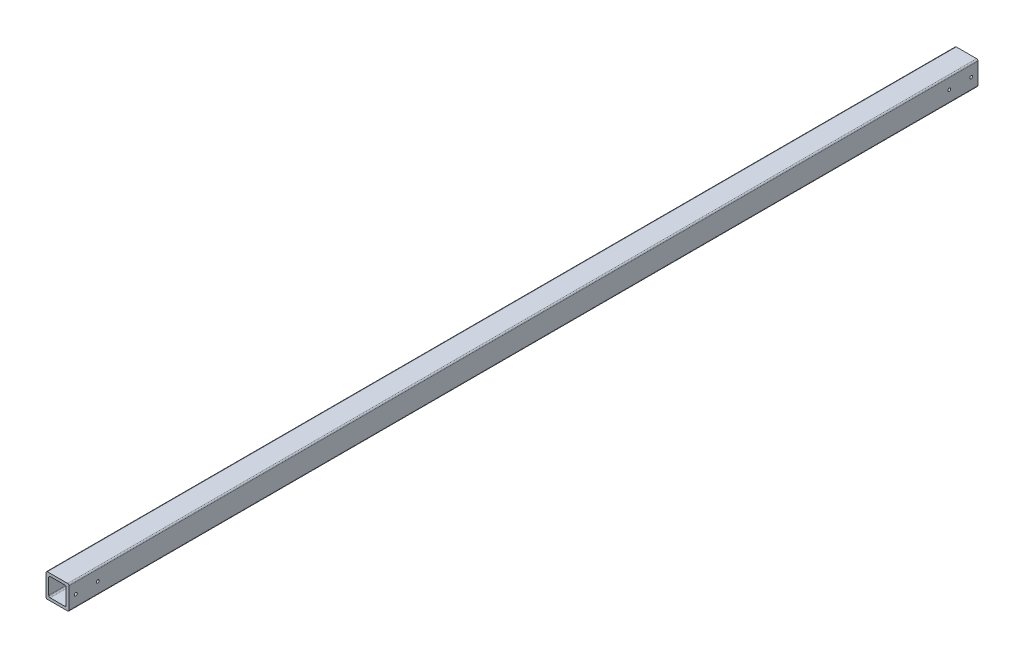
ISO-10303-21;
HEADER;
FILE_DESCRIPTION(('STEP AP214'),'2;1');
FILE_NAME('part.step','',(''),(''),'','','');
FILE_SCHEMA(('AUTOMOTIVE_DESIGN { 1 0 10303 214 1 1 1 1 }'));
ENDSEC;
DATA;
#1=APPLICATION_CONTEXT('core data for automotive mechanical design processes');
#2=APPLICATION_PROTOCOL_DEFINITION('international standard','automotive_design',2000,#1);
#3=PRODUCT_CONTEXT('',#1,'mechanical');
#4=PRODUCT('Part','Part','',(#3));
#5=PRODUCT_RELATED_PRODUCT_CATEGORY('part','',(#4));
#6=PRODUCT_DEFINITION_FORMATION('','',#4);
#7=PRODUCT_DEFINITION_CONTEXT('part definition',#1,'design');
#8=PRODUCT_DEFINITION('design','',#6,#7);
#9=PRODUCT_DEFINITION_SHAPE('','',#8);
#10=(LENGTH_UNIT() NAMED_UNIT(*) SI_UNIT(.MILLI.,.METRE.));
#11=(NAMED_UNIT(*) PLANE_ANGLE_UNIT() SI_UNIT($,.RADIAN.));
#12=(NAMED_UNIT(*) SI_UNIT($,.STERADIAN.) SOLID_ANGLE_UNIT());
#13=UNCERTAINTY_MEASURE_WITH_UNIT(LENGTH_MEASURE(1.E-05),#10,'distance_accuracy_value','');
#14=(GEOMETRIC_REPRESENTATION_CONTEXT(3) GLOBAL_UNCERTAINTY_ASSIGNED_CONTEXT((#13)) GLOBAL_UNIT_ASSIGNED_CONTEXT((#10,
#11,#12)) REPRESENTATION_CONTEXT('',''));
#15=CARTESIAN_POINT('',(0.,0.,0.));
#16=DIRECTION('',(0.,0.,1.));
#17=DIRECTION('',(1.,0.,0.));
#18=AXIS2_PLACEMENT_3D('',#15,#16,#17);
#19=CARTESIAN_POINT('',(-23.368,44.45,844.55));
#20=DIRECTION('',(0.,0.,-1.));
#21=DIRECTION('',(-1.,0.,0.));
#22=AXIS2_PLACEMENT_3D('',#19,#20,#21);
#23=PLANE('',#22);
#24=DIRECTION('',(1.,0.,0.));
#25=VECTOR('',#24,1.);
#26=CARTESIAN_POINT('',(13.97,5.08,844.55));
#27=LINE('',#26,#25);
#28=CARTESIAN_POINT('',(-15.748,5.08,844.55));
#29=VERTEX_POINT('',#28);
#30=CARTESIAN_POINT('',(11.43,5.08,844.55));
#31=VERTEX_POINT('',#30);
#32=EDGE_CURVE('E177',#29,#31,#27,.T.);
#33=ORIENTED_EDGE('',*,*,#32,.F.);
#34=CARTESIAN_POINT('',(-15.748,7.62,844.55));
#35=DIRECTION('',(0.,0.,-1.));
#36=DIRECTION('',(-1.,0.,0.));
#37=AXIS2_PLACEMENT_3D('',#34,#35,#36);
#38=CIRCLE('',#37,2.54);
#39=CARTESIAN_POINT('',(-18.288,7.62,844.55));
#40=VERTEX_POINT('',#39);
#41=EDGE_CURVE('E50',#29,#40,#38,.T.);
#42=ORIENTED_EDGE('',*,*,#41,.T.);
#43=DIRECTION('',(0.,-1.,0.));
#44=VECTOR('',#43,1.);
#45=CARTESIAN_POINT('',(-18.288,5.08,844.55));
#46=LINE('',#45,#44);
#47=CARTESIAN_POINT('',(-18.288,36.83,844.55));
#48=VERTEX_POINT('',#47);
#49=EDGE_CURVE('E167',#48,#40,#46,.T.);
#50=ORIENTED_EDGE('',*,*,#49,.F.);
#51=CARTESIAN_POINT('',(-15.748,36.83,844.55));
#52=DIRECTION('',(0.,0.,-1.));
#53=DIRECTION('',(-1.,0.,0.));
#54=AXIS2_PLACEMENT_3D('',#51,#52,#53);
#55=CIRCLE('',#54,2.54);
#56=CARTESIAN_POINT('',(-15.748,39.37,844.55));
#57=VERTEX_POINT('',#56);
#58=EDGE_CURVE('E154',#48,#57,#55,.T.);
#59=ORIENTED_EDGE('',*,*,#58,.T.);
#60=DIRECTION('',(-1.,0.,0.));
#61=VECTOR('',#60,1.);
#62=CARTESIAN_POINT('',(13.97,39.37,844.55));
#63=LINE('',#62,#61);
#64=CARTESIAN_POINT('',(11.43,39.37,844.55));
#65=VERTEX_POINT('',#64);
#66=EDGE_CURVE('E191',#65,#57,#63,.T.);
#67=ORIENTED_EDGE('',*,*,#66,.F.);
#68=CARTESIAN_POINT('',(11.43,36.83,844.55));
#69=DIRECTION('',(0.,0.,-1.));
#70=DIRECTION('',(-1.,0.,0.));
#71=AXIS2_PLACEMENT_3D('',#68,#69,#70);
#72=CIRCLE('',#71,2.54);
#73=CARTESIAN_POINT('',(13.97,36.83,844.55));
#74=VERTEX_POINT('',#73);
#75=EDGE_CURVE('E258',#65,#74,#72,.T.);
#76=ORIENTED_EDGE('',*,*,#75,.T.);
#77=DIRECTION('',(0.,1.,0.));
#78=VECTOR('',#77,1.);
#79=CARTESIAN_POINT('',(13.97,5.08,844.55));
#80=LINE('',#79,#78);
#81=CARTESIAN_POINT('',(13.97,7.62,844.55));
#82=VERTEX_POINT('',#81);
#83=EDGE_CURVE('E182',#82,#74,#80,.T.);
#84=ORIENTED_EDGE('',*,*,#83,.F.);
#85=CARTESIAN_POINT('',(11.43,7.62,844.55));
#86=DIRECTION('',(0.,0.,-1.));
#87=DIRECTION('',(-1.,0.,0.));
#88=AXIS2_PLACEMENT_3D('',#85,#86,#87);
#89=CIRCLE('',#88,2.54);
#90=EDGE_CURVE('E263',#82,#31,#89,.T.);
#91=ORIENTED_EDGE('',*,*,#90,.T.);
#92=EDGE_LOOP('',(#33,#42,#50,#59,#67,#76,#84,#91));
#93=FACE_BOUND('',#92,.T.);
#94=DIRECTION('',(1.,0.,0.));
#95=VECTOR('',#94,1.);
#96=CARTESIAN_POINT('',(-23.368,0.,844.55));
#97=LINE('',#96,#95);
#98=CARTESIAN_POINT('',(-20.828,0.,844.55));
#99=VERTEX_POINT('',#98);
#100=CARTESIAN_POINT('',(16.891,0.,844.55));
#101=VERTEX_POINT('',#100);
#102=EDGE_CURVE('E200',#99,#101,#97,.T.);
#103=ORIENTED_EDGE('',*,*,#102,.T.);
#104=CARTESIAN_POINT('',(16.891,2.54,844.55));
#105=DIRECTION('',(0.,0.,-1.));
#106=DIRECTION('',(-1.,0.,0.));
#107=AXIS2_PLACEMENT_3D('',#104,#105,#106);
#108=CIRCLE('',#107,2.54);
#109=CARTESIAN_POINT('',(19.431,2.54,844.55));
#110=VERTEX_POINT('',#109);
#111=EDGE_CURVE('E240',#101,#110,#108,.F.);
#112=ORIENTED_EDGE('',*,*,#111,.T.);
#113=DIRECTION('',(0.,-1.,0.));
#114=VECTOR('',#113,1.);
#115=CARTESIAN_POINT('',(19.431,44.45,844.55));
#116=LINE('',#115,#114);
#117=CARTESIAN_POINT('',(19.431,41.91,844.55));
#118=VERTEX_POINT('',#117);
#119=EDGE_CURVE('E187',#118,#110,#116,.T.);
#120=ORIENTED_EDGE('',*,*,#119,.F.);
#121=CARTESIAN_POINT('',(16.891,41.91,844.55));
#122=DIRECTION('',(0.,0.,-1.));
#123=DIRECTION('',(-1.,0.,0.));
#124=AXIS2_PLACEMENT_3D('',#121,#122,#123);
#125=CIRCLE('',#124,2.54);
#126=CARTESIAN_POINT('',(16.891,44.45,844.55));
#127=VERTEX_POINT('',#126);
#128=EDGE_CURVE('E231',#118,#127,#125,.F.);
#129=ORIENTED_EDGE('',*,*,#128,.T.);
#130=DIRECTION('',(1.,0.,0.));
#131=VECTOR('',#130,1.);
#132=CARTESIAN_POINT('',(-23.368,44.45,844.55));
#133=LINE('',#132,#131);
#134=CARTESIAN_POINT('',(-20.828,44.45,844.55));
#135=VERTEX_POINT('',#134);
#136=EDGE_CURVE('E198',#135,#127,#133,.T.);
#137=ORIENTED_EDGE('',*,*,#136,.F.);
#138=CARTESIAN_POINT('',(-20.828,41.91,844.55));
#139=DIRECTION('',(0.,0.,-1.));
#140=DIRECTION('',(-1.,0.,0.));
#141=AXIS2_PLACEMENT_3D('',#138,#139,#140);
#142=CIRCLE('',#141,2.54);
#143=CARTESIAN_POINT('',(-23.368,41.91,844.55));
#144=VERTEX_POINT('',#143);
#145=EDGE_CURVE('E233',#135,#144,#142,.F.);
#146=ORIENTED_EDGE('',*,*,#145,.T.);
#147=DIRECTION('',(0.,-1.,0.));
#148=VECTOR('',#147,1.);
#149=CARTESIAN_POINT('',(-23.368,44.45,844.55));
#150=LINE('',#149,#148);
#151=CARTESIAN_POINT('',(-23.368,2.54,844.55));
#152=VERTEX_POINT('',#151);
#153=EDGE_CURVE('E202',#144,#152,#150,.T.);
#154=ORIENTED_EDGE('',*,*,#153,.T.);
#155=CARTESIAN_POINT('',(-20.828,2.54,844.55));
#156=DIRECTION('',(0.,0.,-1.));
#157=DIRECTION('',(-1.,0.,0.));
#158=AXIS2_PLACEMENT_3D('',#155,#156,#157);
#159=CIRCLE('',#158,2.54);
#160=EDGE_CURVE('E232',#152,#99,#159,.F.);
#161=ORIENTED_EDGE('',*,*,#160,.T.);
#162=EDGE_LOOP('',(#103,#112,#120,#129,#137,#146,#154,#161));
#163=FACE_BOUND('',#162,.T.);
#164=ADVANCED_FACE('F39',(#93,#163),#23,.F.);
#165=CARTESIAN_POINT('',(0.,44.45,0.));
#166=DIRECTION('',(0.,-1.,0.));
#167=DIRECTION('',(0.,0.,-1.));
#168=AXIS2_PLACEMENT_3D('',#165,#166,#167);
#169=PLANE('',#168);
#170=ORIENTED_EDGE('',*,*,#136,.T.);
#171=DIRECTION('',(0.,0.,1.));
#172=VECTOR('',#171,1.);
#173=CARTESIAN_POINT('',(16.891,44.45,0.));
#174=LINE('',#173,#172);
#175=CARTESIAN_POINT('',(16.891,44.45,-844.55));
#176=VERTEX_POINT('',#175);
#177=EDGE_CURVE('E165',#127,#176,#174,.F.);
#178=ORIENTED_EDGE('',*,*,#177,.T.);
#179=DIRECTION('',(-1.,0.,0.));
#180=VECTOR('',#179,1.);
#181=CARTESIAN_POINT('',(-23.368,44.45,-844.55));
#182=LINE('',#181,#180);
#183=CARTESIAN_POINT('',(-20.828,44.45,-844.55));
#184=VERTEX_POINT('',#183);
#185=EDGE_CURVE('E196',#176,#184,#182,.T.);
#186=ORIENTED_EDGE('',*,*,#185,.T.);
#187=DIRECTION('',(0.,0.,1.));
#188=VECTOR('',#187,1.);
#189=CARTESIAN_POINT('',(-20.828,44.45,0.));
#190=LINE('',#189,#188);
#191=EDGE_CURVE('E253',#184,#135,#190,.T.);
#192=ORIENTED_EDGE('',*,*,#191,.T.);
#193=EDGE_LOOP('',(#170,#178,#186,#192));
#194=FACE_BOUND('',#193,.T.);
#195=ADVANCED_FACE('F353',(#194),#169,.F.);
#196=CARTESIAN_POINT('',(0.,0.,0.));
#197=DIRECTION('',(0.,-1.,0.));
#198=DIRECTION('',(0.,0.,-1.));
#199=AXIS2_PLACEMENT_3D('',#196,#197,#198);
#200=PLANE('',#199);
#201=DIRECTION('',(-1.,0.,0.));
#202=VECTOR('',#201,1.);
#203=CARTESIAN_POINT('',(-23.368,0.,-844.55));
#204=LINE('',#203,#202);
#205=CARTESIAN_POINT('',(16.891,0.,-844.55));
#206=VERTEX_POINT('',#205);
#207=CARTESIAN_POINT('',(-20.828,0.,-844.55));
#208=VERTEX_POINT('',#207);
#209=EDGE_CURVE('E205',#206,#208,#204,.T.);
#210=ORIENTED_EDGE('',*,*,#209,.F.);
#211=DIRECTION('',(0.,0.,1.));
#212=VECTOR('',#211,1.);
#213=CARTESIAN_POINT('',(16.891,0.,844.55));
#214=LINE('',#213,#212);
#215=EDGE_CURVE('E226',#206,#101,#214,.T.);
#216=ORIENTED_EDGE('',*,*,#215,.T.);
#217=ORIENTED_EDGE('',*,*,#102,.F.);
#218=DIRECTION('',(0.,0.,1.));
#219=VECTOR('',#218,1.);
#220=CARTESIAN_POINT('',(-20.828,0.,-844.55));
#221=LINE('',#220,#219);
#222=EDGE_CURVE('E228',#99,#208,#221,.F.);
#223=ORIENTED_EDGE('',*,*,#222,.T.);
#224=EDGE_LOOP('',(#210,#216,#217,#223));
#225=FACE_BOUND('',#224,.T.);
#226=ADVANCED_FACE('F357',(#225),#200,.T.);
#227=CARTESIAN_POINT('',(-23.368,44.45,-844.55));
#228=DIRECTION('',(0.,0.,1.));
#229=DIRECTION('',(1.,0.,0.));
#230=AXIS2_PLACEMENT_3D('',#227,#228,#229);
#231=PLANE('',#230);
#232=DIRECTION('',(0.,1.,0.));
#233=VECTOR('',#232,1.);
#234=CARTESIAN_POINT('',(13.97,5.08,-844.55));
#235=LINE('',#234,#233);
#236=CARTESIAN_POINT('',(13.97,7.62,-844.55));
#237=VERTEX_POINT('',#236);
#238=CARTESIAN_POINT('',(13.97,36.83,-844.55));
#239=VERTEX_POINT('',#238);
#240=EDGE_CURVE('E271',#237,#239,#235,.T.);
#241=ORIENTED_EDGE('',*,*,#240,.T.);
#242=CARTESIAN_POINT('',(11.43,36.83,-844.55));
#243=DIRECTION('',(0.,0.,1.));
#244=DIRECTION('',(1.,0.,0.));
#245=AXIS2_PLACEMENT_3D('',#242,#243,#244);
#246=CIRCLE('',#245,2.54);
#247=CARTESIAN_POINT('',(11.43,39.37,-844.55));
#248=VERTEX_POINT('',#247);
#249=EDGE_CURVE('E262',#239,#248,#246,.T.);
#250=ORIENTED_EDGE('',*,*,#249,.T.);
#251=DIRECTION('',(-1.,0.,0.));
#252=VECTOR('',#251,1.);
#253=CARTESIAN_POINT('',(13.97,39.37,-844.55));
#254=LINE('',#253,#252);
#255=CARTESIAN_POINT('',(-15.748,39.37,-844.55));
#256=VERTEX_POINT('',#255);
#257=EDGE_CURVE('E186',#248,#256,#254,.T.);
#258=ORIENTED_EDGE('',*,*,#257,.T.);
#259=CARTESIAN_POINT('',(-15.748,36.83,-844.55));
#260=DIRECTION('',(0.,0.,1.));
#261=DIRECTION('',(1.,0.,0.));
#262=AXIS2_PLACEMENT_3D('',#259,#260,#261);
#263=CIRCLE('',#262,2.54);
#264=CARTESIAN_POINT('',(-18.288,36.83,-844.55));
#265=VERTEX_POINT('',#264);
#266=EDGE_CURVE('E161',#256,#265,#263,.T.);
#267=ORIENTED_EDGE('',*,*,#266,.T.);
#268=DIRECTION('',(0.,-1.,0.));
#269=VECTOR('',#268,1.);
#270=CARTESIAN_POINT('',(-18.288,5.08,-844.55));
#271=LINE('',#270,#269);
#272=CARTESIAN_POINT('',(-18.288,7.62,-844.55));
#273=VERTEX_POINT('',#272);
#274=EDGE_CURVE('E173',#265,#273,#271,.T.);
#275=ORIENTED_EDGE('',*,*,#274,.T.);
#276=CARTESIAN_POINT('',(-15.748,7.62,-844.55));
#277=DIRECTION('',(0.,0.,1.));
#278=DIRECTION('',(1.,0.,0.));
#279=AXIS2_PLACEMENT_3D('',#276,#277,#278);
#280=CIRCLE('',#279,2.54);
#281=CARTESIAN_POINT('',(-15.748,5.08,-844.55));
#282=VERTEX_POINT('',#281);
#283=EDGE_CURVE('E11',#273,#282,#280,.T.);
#284=ORIENTED_EDGE('',*,*,#283,.T.);
#285=DIRECTION('',(1.,0.,0.));
#286=VECTOR('',#285,1.);
#287=CARTESIAN_POINT('',(13.97,5.08,-844.55));
#288=LINE('',#287,#286);
#289=CARTESIAN_POINT('',(11.43,5.08,-844.55));
#290=VERTEX_POINT('',#289);
#291=EDGE_CURVE('E277',#282,#290,#288,.T.);
#292=ORIENTED_EDGE('',*,*,#291,.T.);
#293=CARTESIAN_POINT('',(11.43,7.62,-844.55));
#294=DIRECTION('',(0.,0.,1.));
#295=DIRECTION('',(1.,0.,0.));
#296=AXIS2_PLACEMENT_3D('',#293,#294,#295);
#297=CIRCLE('',#296,2.54);
#298=EDGE_CURVE('E268',#290,#237,#297,.T.);
#299=ORIENTED_EDGE('',*,*,#298,.T.);
#300=EDGE_LOOP('',(#241,#250,#258,#267,#275,#284,#292,#299));
#301=FACE_BOUND('',#300,.T.);
#302=DIRECTION('',(0.,-1.,0.));
#303=VECTOR('',#302,1.);
#304=CARTESIAN_POINT('',(19.431,44.45,-844.55));
#305=LINE('',#304,#303);
#306=CARTESIAN_POINT('',(19.431,41.91,-844.55));
#307=VERTEX_POINT('',#306);
#308=CARTESIAN_POINT('',(19.431,2.54,-844.55));
#309=VERTEX_POINT('',#308);
#310=EDGE_CURVE('E179',#307,#309,#305,.T.);
#311=ORIENTED_EDGE('',*,*,#310,.T.);
#312=CARTESIAN_POINT('',(16.891,2.54,-844.55));
#313=DIRECTION('',(0.,0.,1.));
#314=DIRECTION('',(1.,0.,0.));
#315=AXIS2_PLACEMENT_3D('',#312,#313,#314);
#316=CIRCLE('',#315,2.54);
#317=EDGE_CURVE('E248',#309,#206,#316,.F.);
#318=ORIENTED_EDGE('',*,*,#317,.T.);
#319=ORIENTED_EDGE('',*,*,#209,.T.);
#320=CARTESIAN_POINT('',(-20.828,2.54,-844.55));
#321=DIRECTION('',(0.,0.,1.));
#322=DIRECTION('',(1.,0.,0.));
#323=AXIS2_PLACEMENT_3D('',#320,#321,#322);
#324=CIRCLE('',#323,2.54);
#325=CARTESIAN_POINT('',(-23.368,2.54,-844.55));
#326=VERTEX_POINT('',#325);
#327=EDGE_CURVE('E53',#208,#326,#324,.F.);
#328=ORIENTED_EDGE('',*,*,#327,.T.);
#329=DIRECTION('',(0.,-1.,0.));
#330=VECTOR('',#329,1.);
#331=CARTESIAN_POINT('',(-23.368,44.45,-844.55));
#332=LINE('',#331,#330);
#333=CARTESIAN_POINT('',(-23.368,41.91,-844.55));
#334=VERTEX_POINT('',#333);
#335=EDGE_CURVE('E208',#334,#326,#332,.T.);
#336=ORIENTED_EDGE('',*,*,#335,.F.);
#337=CARTESIAN_POINT('',(-20.828,41.91,-844.55));
#338=DIRECTION('',(0.,0.,1.));
#339=DIRECTION('',(1.,0.,0.));
#340=AXIS2_PLACEMENT_3D('',#337,#338,#339);
#341=CIRCLE('',#340,2.54);
#342=EDGE_CURVE('E242',#334,#184,#341,.F.);
#343=ORIENTED_EDGE('',*,*,#342,.T.);
#344=ORIENTED_EDGE('',*,*,#185,.F.);
#345=CARTESIAN_POINT('',(16.891,41.91,-844.55));
#346=DIRECTION('',(0.,0.,1.));
#347=DIRECTION('',(1.,0.,0.));
#348=AXIS2_PLACEMENT_3D('',#345,#346,#347);
#349=CIRCLE('',#348,2.54);
#350=EDGE_CURVE('E246',#176,#307,#349,.F.);
#351=ORIENTED_EDGE('',*,*,#350,.T.);
#352=EDGE_LOOP('',(#311,#318,#319,#328,#336,#343,#344,#351));
#353=FACE_BOUND('',#352,.T.);
#354=ADVANCED_FACE('F275',(#301,#353),#231,.F.);
#355=CARTESIAN_POINT('',(-23.368,44.45,844.55));
#356=DIRECTION('',(1.,0.,0.));
#357=DIRECTION('',(0.,0.,-1.));
#358=AXIS2_PLACEMENT_3D('',#355,#356,#357);
#359=PLANE('',#358);
#360=ORIENTED_EDGE('',*,*,#335,.T.);
#361=DIRECTION('',(0.,0.,1.));
#362=VECTOR('',#361,1.);
#363=CARTESIAN_POINT('',(-23.368,2.54,844.55));
#364=LINE('',#363,#362);
#365=EDGE_CURVE('E255',#326,#152,#364,.T.);
#366=ORIENTED_EDGE('',*,*,#365,.T.);
#367=ORIENTED_EDGE('',*,*,#153,.F.);
#368=DIRECTION('',(0.,0.,1.));
#369=VECTOR('',#368,1.);
#370=CARTESIAN_POINT('',(-23.368,41.91,844.55));
#371=LINE('',#370,#369);
#372=EDGE_CURVE('E62',#144,#334,#371,.F.);
#373=ORIENTED_EDGE('',*,*,#372,.T.);
#374=EDGE_LOOP('',(#360,#366,#367,#373));
#375=FACE_BOUND('',#374,.T.);
#376=ADVANCED_FACE('F365',(#375),#359,.F.);
#377=CARTESIAN_POINT('',(-18.288,5.08,-844.55));
#378=DIRECTION('',(-1.,0.,0.));
#379=DIRECTION('',(0.,0.,1.));
#380=AXIS2_PLACEMENT_3D('',#377,#378,#379);
#381=PLANE('',#380);
#382=ORIENTED_EDGE('',*,*,#274,.F.);
#383=DIRECTION('',(0.,0.,1.));
#384=VECTOR('',#383,1.);
#385=CARTESIAN_POINT('',(-18.288,36.83,844.55));
#386=LINE('',#385,#384);
#387=EDGE_CURVE('E159',#265,#48,#386,.T.);
#388=ORIENTED_EDGE('',*,*,#387,.T.);
#389=ORIENTED_EDGE('',*,*,#49,.T.);
#390=DIRECTION('',(0.,0.,1.));
#391=VECTOR('',#390,1.);
#392=CARTESIAN_POINT('',(-18.288,7.62,-844.55));
#393=LINE('',#392,#391);
#394=EDGE_CURVE('E174',#40,#273,#393,.F.);
#395=ORIENTED_EDGE('',*,*,#394,.T.);
#396=EDGE_LOOP('',(#382,#388,#389,#395));
#397=FACE_BOUND('',#396,.T.);
#398=ADVANCED_FACE('F169',(#397),#381,.F.);
#399=CARTESIAN_POINT('',(13.97,39.37,-844.55));
#400=DIRECTION('',(0.,1.,0.));
#401=DIRECTION('',(-1.,0.,0.));
#402=AXIS2_PLACEMENT_3D('',#399,#400,#401);
#403=PLANE('',#402);
#404=ORIENTED_EDGE('',*,*,#66,.T.);
#405=DIRECTION('',(0.,0.,1.));
#406=VECTOR('',#405,1.);
#407=CARTESIAN_POINT('',(-15.748,39.37,-844.55));
#408=LINE('',#407,#406);
#409=EDGE_CURVE('E157',#57,#256,#408,.F.);
#410=ORIENTED_EDGE('',*,*,#409,.T.);
#411=ORIENTED_EDGE('',*,*,#257,.F.);
#412=DIRECTION('',(0.,0.,1.));
#413=VECTOR('',#412,1.);
#414=CARTESIAN_POINT('',(11.43,39.37,844.55));
#415=LINE('',#414,#413);
#416=EDGE_CURVE('E172',#248,#65,#415,.T.);
#417=ORIENTED_EDGE('',*,*,#416,.T.);
#418=EDGE_LOOP('',(#404,#410,#411,#417));
#419=FACE_BOUND('',#418,.T.);
#420=ADVANCED_FACE('F326',(#419),#403,.F.);
#421=CARTESIAN_POINT('',(13.97,5.08,-844.55));
#422=DIRECTION('',(1.,0.,0.));
#423=DIRECTION('',(0.,1.,0.));
#424=AXIS2_PLACEMENT_3D('',#421,#422,#423);
#425=PLANE('',#424);
#426=CARTESIAN_POINT('',(13.97,22.2249999999998,-831.85));
#427=DIRECTION('',(-1.,0.,0.));
#428=DIRECTION('',(0.,0.,1.));
#429=AXIS2_PLACEMENT_3D('',#426,#427,#428);
#430=CIRCLE('',#429,2.65429999999999);
#431=CARTESIAN_POINT('',(13.97,22.2249999999998,-829.1957));
#432=VERTEX_POINT('',#431);
#433=EDGE_CURVE('E319',#432,#432,#430,.T.);
#434=ORIENTED_EDGE('',*,*,#433,.F.);
#435=EDGE_LOOP('',(#434));
#436=FACE_BOUND('',#435,.T.);
#437=CARTESIAN_POINT('',(13.97,22.2249999999998,-791.21));
#438=DIRECTION('',(-1.,0.,0.));
#439=DIRECTION('',(0.,0.,1.));
#440=AXIS2_PLACEMENT_3D('',#437,#438,#439);
#441=CIRCLE('',#440,2.65429999999999);
#442=CARTESIAN_POINT('',(13.97,22.2249999999998,-788.5557));
#443=VERTEX_POINT('',#442);
#444=EDGE_CURVE('E315',#443,#443,#441,.T.);
#445=ORIENTED_EDGE('',*,*,#444,.F.);
#446=EDGE_LOOP('',(#445));
#447=FACE_BOUND('',#446,.T.);
#448=CARTESIAN_POINT('',(13.97,22.2249999999998,791.21));
#449=DIRECTION('',(-1.,0.,0.));
#450=DIRECTION('',(0.,0.,1.));
#451=AXIS2_PLACEMENT_3D('',#448,#449,#450);
#452=CIRCLE('',#451,2.65429999999999);
#453=CARTESIAN_POINT('',(13.97,22.2249999999998,793.8643));
#454=VERTEX_POINT('',#453);
#455=EDGE_CURVE('E306',#454,#454,#452,.T.);
#456=ORIENTED_EDGE('',*,*,#455,.F.);
#457=EDGE_LOOP('',(#456));
#458=FACE_BOUND('',#457,.T.);
#459=CARTESIAN_POINT('',(13.97,22.2249999999998,831.85));
#460=DIRECTION('',(-1.,0.,0.));
#461=DIRECTION('',(0.,0.,1.));
#462=AXIS2_PLACEMENT_3D('',#459,#460,#461);
#463=CIRCLE('',#462,2.65429999999999);
#464=CARTESIAN_POINT('',(13.97,22.2249999999998,834.5043));
#465=VERTEX_POINT('',#464);
#466=EDGE_CURVE('E297',#465,#465,#463,.T.);
#467=ORIENTED_EDGE('',*,*,#466,.F.);
#468=EDGE_LOOP('',(#467));
#469=FACE_BOUND('',#468,.T.);
#470=ORIENTED_EDGE('',*,*,#83,.T.);
#471=DIRECTION('',(0.,0.,1.));
#472=VECTOR('',#471,1.);
#473=CARTESIAN_POINT('',(13.97,36.83,-844.55));
#474=LINE('',#473,#472);
#475=EDGE_CURVE('E218',#74,#239,#474,.F.);
#476=ORIENTED_EDGE('',*,*,#475,.T.);
#477=ORIENTED_EDGE('',*,*,#240,.F.);
#478=DIRECTION('',(0.,0.,1.));
#479=VECTOR('',#478,1.);
#480=CARTESIAN_POINT('',(13.97,7.62,844.55));
#481=LINE('',#480,#479);
#482=EDGE_CURVE('E216',#237,#82,#481,.T.);
#483=ORIENTED_EDGE('',*,*,#482,.T.);
#484=EDGE_LOOP('',(#470,#476,#477,#483));
#485=FACE_BOUND('',#484,.T.);
#486=ADVANCED_FACE('F281',(#436,#447,#458,#469,#485),#425,.F.);
#487=CARTESIAN_POINT('',(13.97,5.08,-844.55));
#488=DIRECTION('',(0.,-1.,0.));
#489=DIRECTION('',(1.,0.,0.));
#490=AXIS2_PLACEMENT_3D('',#487,#488,#489);
#491=PLANE('',#490);
#492=ORIENTED_EDGE('',*,*,#32,.T.);
#493=DIRECTION('',(0.,0.,1.));
#494=VECTOR('',#493,1.);
#495=CARTESIAN_POINT('',(11.43,5.08,-844.55));
#496=LINE('',#495,#494);
#497=EDGE_CURVE('E225',#31,#290,#496,.F.);
#498=ORIENTED_EDGE('',*,*,#497,.T.);
#499=ORIENTED_EDGE('',*,*,#291,.F.);
#500=DIRECTION('',(0.,0.,1.));
#501=VECTOR('',#500,1.);
#502=CARTESIAN_POINT('',(-15.748,5.08,844.55));
#503=LINE('',#502,#501);
#504=EDGE_CURVE('E223',#282,#29,#503,.T.);
#505=ORIENTED_EDGE('',*,*,#504,.T.);
#506=EDGE_LOOP('',(#492,#498,#499,#505));
#507=FACE_BOUND('',#506,.T.);
#508=ADVANCED_FACE('F288',(#507),#491,.F.);
#509=CARTESIAN_POINT('',(19.431,44.45,-844.55));
#510=DIRECTION('',(-1.,0.,0.));
#511=DIRECTION('',(0.,-1.,0.));
#512=AXIS2_PLACEMENT_3D('',#509,#510,#511);
#513=PLANE('',#512);
#514=CARTESIAN_POINT('',(19.431,22.2249999999998,-831.85));
#515=DIRECTION('',(-1.,0.,0.));
#516=DIRECTION('',(0.,0.,1.));
#517=AXIS2_PLACEMENT_3D('',#514,#515,#516);
#518=CIRCLE('',#517,2.6543);
#519=CARTESIAN_POINT('',(19.431,22.2249999999998,-829.1957));
#520=VERTEX_POINT('',#519);
#521=EDGE_CURVE('E314',#520,#520,#518,.T.);
#522=ORIENTED_EDGE('',*,*,#521,.T.);
#523=EDGE_LOOP('',(#522));
#524=FACE_BOUND('',#523,.T.);
#525=CARTESIAN_POINT('',(19.431,22.2249999999998,-791.21));
#526=DIRECTION('',(-1.,0.,0.));
#527=DIRECTION('',(0.,0.,1.));
#528=AXIS2_PLACEMENT_3D('',#525,#526,#527);
#529=CIRCLE('',#528,2.6543);
#530=CARTESIAN_POINT('',(19.431,22.2249999999998,-788.5557));
#531=VERTEX_POINT('',#530);
#532=EDGE_CURVE('E307',#531,#531,#529,.T.);
#533=ORIENTED_EDGE('',*,*,#532,.T.);
#534=EDGE_LOOP('',(#533));
#535=FACE_BOUND('',#534,.T.);
#536=CARTESIAN_POINT('',(19.431,22.2249999999998,791.21));
#537=DIRECTION('',(-1.,0.,0.));
#538=DIRECTION('',(0.,0.,1.));
#539=AXIS2_PLACEMENT_3D('',#536,#537,#538);
#540=CIRCLE('',#539,2.6543);
#541=CARTESIAN_POINT('',(19.431,22.2249999999998,793.8643));
#542=VERTEX_POINT('',#541);
#543=EDGE_CURVE('E303',#542,#542,#540,.T.);
#544=ORIENTED_EDGE('',*,*,#543,.T.);
#545=EDGE_LOOP('',(#544));
#546=FACE_BOUND('',#545,.T.);
#547=CARTESIAN_POINT('',(19.431,22.2249999999998,831.85));
#548=DIRECTION('',(-1.,0.,0.));
#549=DIRECTION('',(0.,0.,1.));
#550=AXIS2_PLACEMENT_3D('',#547,#548,#549);
#551=CIRCLE('',#550,2.6543);
#552=CARTESIAN_POINT('',(19.431,22.2249999999998,834.5043));
#553=VERTEX_POINT('',#552);
#554=EDGE_CURVE('E298',#553,#553,#551,.T.);
#555=ORIENTED_EDGE('',*,*,#554,.T.);
#556=EDGE_LOOP('',(#555));
#557=FACE_BOUND('',#556,.T.);
#558=ORIENTED_EDGE('',*,*,#119,.T.);
#559=DIRECTION('',(0.,0.,1.));
#560=VECTOR('',#559,1.);
#561=CARTESIAN_POINT('',(19.431,2.54,-844.55));
#562=LINE('',#561,#560);
#563=EDGE_CURVE('E245',#110,#309,#562,.F.);
#564=ORIENTED_EDGE('',*,*,#563,.T.);
#565=ORIENTED_EDGE('',*,*,#310,.F.);
#566=DIRECTION('',(0.,0.,1.));
#567=VECTOR('',#566,1.);
#568=CARTESIAN_POINT('',(19.431,41.91,-844.55));
#569=LINE('',#568,#567);
#570=EDGE_CURVE('E237',#307,#118,#569,.T.);
#571=ORIENTED_EDGE('',*,*,#570,.T.);
#572=EDGE_LOOP('',(#558,#564,#565,#571));
#573=FACE_BOUND('',#572,.T.);
#574=ADVANCED_FACE('F340',(#524,#535,#546,#557,#573),#513,.F.);
#575=CARTESIAN_POINT('',(13.97,22.2249999999998,831.85));
#576=DIRECTION('',(-1.,0.,0.));
#577=DIRECTION('',(0.,0.,1.));
#578=AXIS2_PLACEMENT_3D('',#575,#576,#577);
#579=CYLINDRICAL_SURFACE('',#578,2.65429999999999);
#580=ORIENTED_EDGE('',*,*,#554,.F.);
#581=EDGE_LOOP('',(#580));
#582=FACE_BOUND('',#581,.T.);
#583=ORIENTED_EDGE('',*,*,#466,.T.);
#584=EDGE_LOOP('',(#583));
#585=FACE_BOUND('',#584,.T.);
#586=ADVANCED_FACE('F335',(#582,#585),#579,.F.);
#587=CARTESIAN_POINT('',(13.97,22.2249999999998,791.21));
#588=DIRECTION('',(-1.,0.,0.));
#589=DIRECTION('',(0.,0.,1.));
#590=AXIS2_PLACEMENT_3D('',#587,#588,#589);
#591=CYLINDRICAL_SURFACE('',#590,2.65429999999999);
#592=ORIENTED_EDGE('',*,*,#543,.F.);
#593=EDGE_LOOP('',(#592));
#594=FACE_BOUND('',#593,.T.);
#595=ORIENTED_EDGE('',*,*,#455,.T.);
#596=EDGE_LOOP('',(#595));
#597=FACE_BOUND('',#596,.T.);
#598=ADVANCED_FACE('F337',(#594,#597),#591,.F.);
#599=CARTESIAN_POINT('',(13.97,22.2249999999998,-791.21));
#600=DIRECTION('',(-1.,0.,0.));
#601=DIRECTION('',(0.,0.,1.));
#602=AXIS2_PLACEMENT_3D('',#599,#600,#601);
#603=CYLINDRICAL_SURFACE('',#602,2.65429999999999);
#604=ORIENTED_EDGE('',*,*,#532,.F.);
#605=EDGE_LOOP('',(#604));
#606=FACE_BOUND('',#605,.T.);
#607=ORIENTED_EDGE('',*,*,#444,.T.);
#608=EDGE_LOOP('',(#607));
#609=FACE_BOUND('',#608,.T.);
#610=ADVANCED_FACE('F345',(#606,#609),#603,.F.);
#611=CARTESIAN_POINT('',(13.97,22.2249999999998,-831.85));
#612=DIRECTION('',(-1.,0.,0.));
#613=DIRECTION('',(0.,0.,1.));
#614=AXIS2_PLACEMENT_3D('',#611,#612,#613);
#615=CYLINDRICAL_SURFACE('',#614,2.65429999999999);
#616=ORIENTED_EDGE('',*,*,#521,.F.);
#617=EDGE_LOOP('',(#616));
#618=FACE_BOUND('',#617,.T.);
#619=ORIENTED_EDGE('',*,*,#433,.T.);
#620=EDGE_LOOP('',(#619));
#621=FACE_BOUND('',#620,.T.);
#622=ADVANCED_FACE('F324',(#618,#621),#615,.F.);
#623=CARTESIAN_POINT('',(-15.748,36.83,-844.55));
#624=DIRECTION('',(0.,0.,-1.));
#625=DIRECTION('',(-1.,0.,0.));
#626=AXIS2_PLACEMENT_3D('',#623,#624,#625);
#627=CYLINDRICAL_SURFACE('',#626,2.54);
#628=ORIENTED_EDGE('',*,*,#266,.F.);
#629=ORIENTED_EDGE('',*,*,#409,.F.);
#630=ORIENTED_EDGE('',*,*,#58,.F.);
#631=ORIENTED_EDGE('',*,*,#387,.F.);
#632=EDGE_LOOP('',(#628,#629,#630,#631));
#633=FACE_BOUND('',#632,.T.);
#634=ADVANCED_FACE('F158',(#633),#627,.F.);
#635=CARTESIAN_POINT('',(11.43,36.83,-844.55));
#636=DIRECTION('',(0.,0.,-1.));
#637=DIRECTION('',(-1.,0.,0.));
#638=AXIS2_PLACEMENT_3D('',#635,#636,#637);
#639=CYLINDRICAL_SURFACE('',#638,2.54);
#640=ORIENTED_EDGE('',*,*,#249,.F.);
#641=ORIENTED_EDGE('',*,*,#475,.F.);
#642=ORIENTED_EDGE('',*,*,#75,.F.);
#643=ORIENTED_EDGE('',*,*,#416,.F.);
#644=EDGE_LOOP('',(#640,#641,#642,#643));
#645=FACE_BOUND('',#644,.T.);
#646=ADVANCED_FACE('F367',(#645),#639,.F.);
#647=CARTESIAN_POINT('',(11.43,7.62,-844.55));
#648=DIRECTION('',(0.,0.,-1.));
#649=DIRECTION('',(-1.,0.,0.));
#650=AXIS2_PLACEMENT_3D('',#647,#648,#649);
#651=CYLINDRICAL_SURFACE('',#650,2.54);
#652=ORIENTED_EDGE('',*,*,#298,.F.);
#653=ORIENTED_EDGE('',*,*,#497,.F.);
#654=ORIENTED_EDGE('',*,*,#90,.F.);
#655=ORIENTED_EDGE('',*,*,#482,.F.);
#656=EDGE_LOOP('',(#652,#653,#654,#655));
#657=FACE_BOUND('',#656,.T.);
#658=ADVANCED_FACE('F283',(#657),#651,.F.);
#659=CARTESIAN_POINT('',(-15.748,7.62,-844.55));
#660=DIRECTION('',(0.,0.,-1.));
#661=DIRECTION('',(-1.,0.,0.));
#662=AXIS2_PLACEMENT_3D('',#659,#660,#661);
#663=CYLINDRICAL_SURFACE('',#662,2.54);
#664=ORIENTED_EDGE('',*,*,#283,.F.);
#665=ORIENTED_EDGE('',*,*,#394,.F.);
#666=ORIENTED_EDGE('',*,*,#41,.F.);
#667=ORIENTED_EDGE('',*,*,#504,.F.);
#668=EDGE_LOOP('',(#664,#665,#666,#667));
#669=FACE_BOUND('',#668,.T.);
#670=ADVANCED_FACE('F286',(#669),#663,.F.);
#671=CARTESIAN_POINT('',(16.891,2.54,0.));
#672=DIRECTION('',(0.,0.,-1.));
#673=DIRECTION('',(-1.,0.,0.));
#674=AXIS2_PLACEMENT_3D('',#671,#672,#673);
#675=CYLINDRICAL_SURFACE('',#674,2.54);
#676=ORIENTED_EDGE('',*,*,#317,.F.);
#677=ORIENTED_EDGE('',*,*,#563,.F.);
#678=ORIENTED_EDGE('',*,*,#111,.F.);
#679=ORIENTED_EDGE('',*,*,#215,.F.);
#680=EDGE_LOOP('',(#676,#677,#678,#679));
#681=FACE_BOUND('',#680,.T.);
#682=ADVANCED_FACE('F380',(#681),#675,.T.);
#683=CARTESIAN_POINT('',(-20.828,2.54,844.55));
#684=DIRECTION('',(0.,0.,-1.));
#685=DIRECTION('',(-1.,0.,0.));
#686=AXIS2_PLACEMENT_3D('',#683,#684,#685);
#687=CYLINDRICAL_SURFACE('',#686,2.54);
#688=ORIENTED_EDGE('',*,*,#327,.F.);
#689=ORIENTED_EDGE('',*,*,#222,.F.);
#690=ORIENTED_EDGE('',*,*,#160,.F.);
#691=ORIENTED_EDGE('',*,*,#365,.F.);
#692=EDGE_LOOP('',(#688,#689,#690,#691));
#693=FACE_BOUND('',#692,.T.);
#694=ADVANCED_FACE('F379',(#693),#687,.T.);
#695=CARTESIAN_POINT('',(16.891,41.91,-844.55));
#696=DIRECTION('',(0.,0.,1.));
#697=DIRECTION('',(1.,0.,0.));
#698=AXIS2_PLACEMENT_3D('',#695,#696,#697);
#699=CYLINDRICAL_SURFACE('',#698,2.54);
#700=ORIENTED_EDGE('',*,*,#350,.F.);
#701=ORIENTED_EDGE('',*,*,#177,.F.);
#702=ORIENTED_EDGE('',*,*,#128,.F.);
#703=ORIENTED_EDGE('',*,*,#570,.F.);
#704=EDGE_LOOP('',(#700,#701,#702,#703));
#705=FACE_BOUND('',#704,.T.);
#706=ADVANCED_FACE('F384',(#705),#699,.T.);
#707=CARTESIAN_POINT('',(-20.828,41.91,0.));
#708=DIRECTION('',(0.,0.,1.));
#709=DIRECTION('',(1.,0.,0.));
#710=AXIS2_PLACEMENT_3D('',#707,#708,#709);
#711=CYLINDRICAL_SURFACE('',#710,2.54);
#712=ORIENTED_EDGE('',*,*,#342,.F.);
#713=ORIENTED_EDGE('',*,*,#372,.F.);
#714=ORIENTED_EDGE('',*,*,#145,.F.);
#715=ORIENTED_EDGE('',*,*,#191,.F.);
#716=EDGE_LOOP('',(#712,#713,#714,#715));
#717=FACE_BOUND('',#716,.T.);
#718=ADVANCED_FACE('F41',(#717),#711,.T.);
#719=CLOSED_SHELL('',(#164,#195,#226,#354,#376,#398,#420,#486,#508,#574,#586,#598,#610,#622,
#634,#646,#658,#670,#682,#694,#706,#718));
#720=MANIFOLD_SOLID_BREP('B2',#719);
#721=ADVANCED_BREP_SHAPE_REPRESENTATION('',(#18,#720),#14);
#722=SHAPE_DEFINITION_REPRESENTATION(#9,#721);
ENDSEC;
END-ISO-10303-21;
